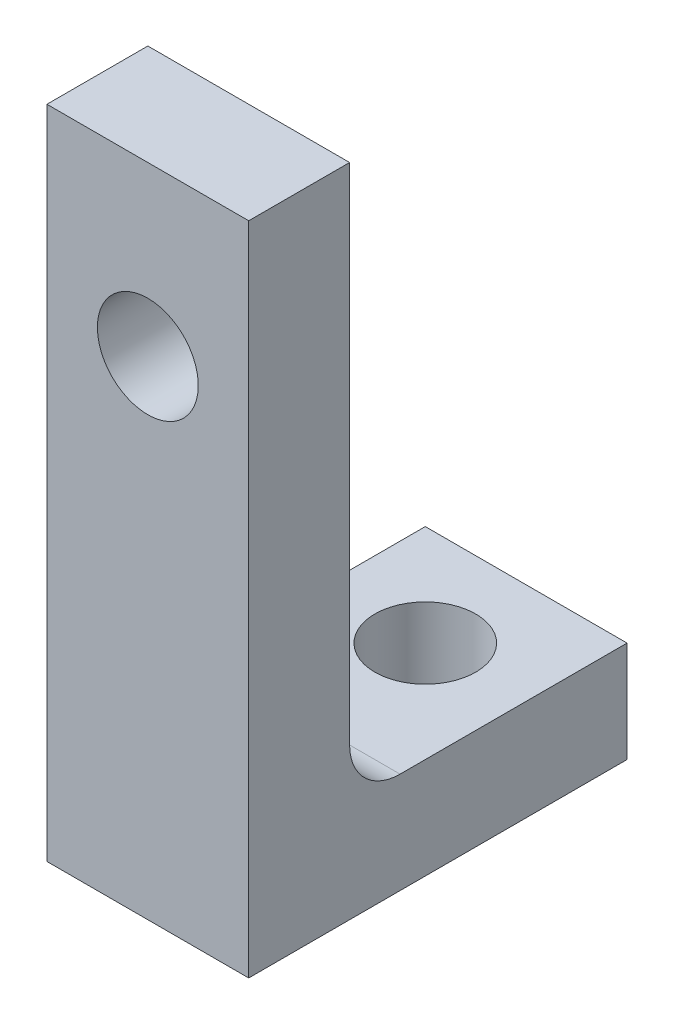
ISO-10303-21;
HEADER;
FILE_DESCRIPTION(('STEP AP214'),'2;1');
FILE_NAME('part.step','',(''),(''),'','','');
FILE_SCHEMA(('AUTOMOTIVE_DESIGN { 1 0 10303 214 1 1 1 1 }'));
ENDSEC;
DATA;
#1=APPLICATION_CONTEXT('core data for automotive mechanical design processes');
#2=APPLICATION_PROTOCOL_DEFINITION('international standard','automotive_design',2000,#1);
#3=PRODUCT_CONTEXT('',#1,'mechanical');
#4=PRODUCT('Part','Part','',(#3));
#5=PRODUCT_RELATED_PRODUCT_CATEGORY('part','',(#4));
#6=PRODUCT_DEFINITION_FORMATION('','',#4);
#7=PRODUCT_DEFINITION_CONTEXT('part definition',#1,'design');
#8=PRODUCT_DEFINITION('design','',#6,#7);
#9=PRODUCT_DEFINITION_SHAPE('','',#8);
#10=(LENGTH_UNIT() NAMED_UNIT(*) SI_UNIT(.MILLI.,.METRE.));
#11=(NAMED_UNIT(*) PLANE_ANGLE_UNIT() SI_UNIT($,.RADIAN.));
#12=(NAMED_UNIT(*) SI_UNIT($,.STERADIAN.) SOLID_ANGLE_UNIT());
#13=UNCERTAINTY_MEASURE_WITH_UNIT(LENGTH_MEASURE(1.E-05),#10,'distance_accuracy_value','');
#14=(GEOMETRIC_REPRESENTATION_CONTEXT(3) GLOBAL_UNCERTAINTY_ASSIGNED_CONTEXT((#13)) GLOBAL_UNIT_ASSIGNED_CONTEXT((#10,
#11,#12)) REPRESENTATION_CONTEXT('',''));
#15=CARTESIAN_POINT('',(0.,0.,0.));
#16=DIRECTION('',(0.,0.,1.));
#17=DIRECTION('',(1.,0.,0.));
#18=AXIS2_PLACEMENT_3D('',#15,#16,#17);
#19=CARTESIAN_POINT('',(4.,0.,-5.5));
#20=DIRECTION('',(0.,-1.,0.));
#21=DIRECTION('',(0.,0.,-1.));
#22=AXIS2_PLACEMENT_3D('',#19,#20,#21);
#23=PLANE('',#22);
#24=CARTESIAN_POINT('',(2.,0.,-3.5));
#25=DIRECTION('',(0.,1.,0.));
#26=DIRECTION('',(0.,0.,1.));
#27=AXIS2_PLACEMENT_3D('',#24,#25,#26);
#28=CIRCLE('',#27,1.);
#29=CARTESIAN_POINT('',(2.,0.,-2.5));
#30=VERTEX_POINT('',#29);
#31=EDGE_CURVE('E176',#30,#30,#28,.T.);
#32=ORIENTED_EDGE('',*,*,#31,.F.);
#33=EDGE_LOOP('',(#32));
#34=FACE_BOUND('',#33,.T.);
#35=DIRECTION('',(0.,0.,1.));
#36=VECTOR('',#35,1.);
#37=CARTESIAN_POINT('',(0.,0.,-5.5));
#38=LINE('',#37,#36);
#39=CARTESIAN_POINT('',(0.,0.,-5.5));
#40=VERTEX_POINT('',#39);
#41=CARTESIAN_POINT('',(0.,0.,-1.));
#42=VERTEX_POINT('',#41);
#43=EDGE_CURVE('E132',#40,#42,#38,.T.);
#44=ORIENTED_EDGE('',*,*,#43,.T.);
#45=DIRECTION('',(-1.,0.,0.));
#46=VECTOR('',#45,1.);
#47=CARTESIAN_POINT('',(4.,0.,-1.));
#48=LINE('',#47,#46);
#49=CARTESIAN_POINT('',(4.,0.,-1.));
#50=VERTEX_POINT('',#49);
#51=EDGE_CURVE('E53',#42,#50,#48,.F.);
#52=ORIENTED_EDGE('',*,*,#51,.T.);
#53=DIRECTION('',(0.,0.,1.));
#54=VECTOR('',#53,1.);
#55=CARTESIAN_POINT('',(4.,0.,-5.5));
#56=LINE('',#55,#54);
#57=CARTESIAN_POINT('',(4.,0.,-5.5));
#58=VERTEX_POINT('',#57);
#59=EDGE_CURVE('E110',#58,#50,#56,.T.);
#60=ORIENTED_EDGE('',*,*,#59,.F.);
#61=DIRECTION('',(-1.,0.,0.));
#62=VECTOR('',#61,1.);
#63=CARTESIAN_POINT('',(4.,0.,-5.5));
#64=LINE('',#63,#62);
#65=EDGE_CURVE('E128',#58,#40,#64,.T.);
#66=ORIENTED_EDGE('',*,*,#65,.T.);
#67=EDGE_LOOP('',(#44,#52,#60,#66));
#68=FACE_BOUND('',#67,.T.);
#69=ADVANCED_FACE('F39',(#34,#68),#23,.F.);
#70=CARTESIAN_POINT('',(4.,0.,0.));
#71=DIRECTION('',(0.,0.,1.));
#72=DIRECTION('',(0.,-1.,0.));
#73=AXIS2_PLACEMENT_3D('',#70,#71,#72);
#74=PLANE('',#73);
#75=CARTESIAN_POINT('',(2.,7.67,0.));
#76=DIRECTION('',(0.,0.,-1.));
#77=DIRECTION('',(0.,1.,0.));
#78=AXIS2_PLACEMENT_3D('',#75,#76,#77);
#79=CIRCLE('',#78,1.);
#80=CARTESIAN_POINT('',(2.,8.67,0.));
#81=VERTEX_POINT('',#80);
#82=EDGE_CURVE('E168',#81,#81,#79,.T.);
#83=ORIENTED_EDGE('',*,*,#82,.F.);
#84=EDGE_LOOP('',(#83));
#85=FACE_BOUND('',#84,.T.);
#86=DIRECTION('',(0.,1.,0.));
#87=VECTOR('',#86,1.);
#88=CARTESIAN_POINT('',(4.,0.,0.));
#89=LINE('',#88,#87);
#90=CARTESIAN_POINT('',(4.,1.,0.));
#91=VERTEX_POINT('',#90);
#92=CARTESIAN_POINT('',(4.,11.,0.));
#93=VERTEX_POINT('',#92);
#94=EDGE_CURVE('E100',#91,#93,#89,.T.);
#95=ORIENTED_EDGE('',*,*,#94,.F.);
#96=DIRECTION('',(-1.,0.,0.));
#97=VECTOR('',#96,1.);
#98=CARTESIAN_POINT('',(0.,1.,0.));
#99=LINE('',#98,#97);
#100=CARTESIAN_POINT('',(0.,1.,0.));
#101=VERTEX_POINT('',#100);
#102=EDGE_CURVE('E113',#91,#101,#99,.T.);
#103=ORIENTED_EDGE('',*,*,#102,.T.);
#104=DIRECTION('',(0.,1.,0.));
#105=VECTOR('',#104,1.);
#106=CARTESIAN_POINT('',(0.,0.,0.));
#107=LINE('',#106,#105);
#108=CARTESIAN_POINT('',(0.,11.,0.));
#109=VERTEX_POINT('',#108);
#110=EDGE_CURVE('E115',#101,#109,#107,.T.);
#111=ORIENTED_EDGE('',*,*,#110,.T.);
#112=DIRECTION('',(-1.,0.,0.));
#113=VECTOR('',#112,1.);
#114=CARTESIAN_POINT('',(4.,11.,0.));
#115=LINE('',#114,#113);
#116=EDGE_CURVE('E109',#93,#109,#115,.T.);
#117=ORIENTED_EDGE('',*,*,#116,.F.);
#118=EDGE_LOOP('',(#95,#103,#111,#117));
#119=FACE_BOUND('',#118,.T.);
#120=ADVANCED_FACE('F112',(#85,#119),#74,.F.);
#121=CARTESIAN_POINT('',(4.,11.,0.));
#122=DIRECTION('',(0.,-1.,0.));
#123=DIRECTION('',(0.,0.,-1.));
#124=AXIS2_PLACEMENT_3D('',#121,#122,#123);
#125=PLANE('',#124);
#126=DIRECTION('',(0.,0.,1.));
#127=VECTOR('',#126,1.);
#128=CARTESIAN_POINT('',(0.,11.,0.));
#129=LINE('',#128,#127);
#130=CARTESIAN_POINT('',(0.,11.,2.));
#131=VERTEX_POINT('',#130);
#132=EDGE_CURVE('E133',#109,#131,#129,.T.);
#133=ORIENTED_EDGE('',*,*,#132,.T.);
#134=DIRECTION('',(-1.,0.,0.));
#135=VECTOR('',#134,1.);
#136=CARTESIAN_POINT('',(4.,11.,2.));
#137=LINE('',#136,#135);
#138=CARTESIAN_POINT('',(4.,11.,2.));
#139=VERTEX_POINT('',#138);
#140=EDGE_CURVE('E117',#139,#131,#137,.T.);
#141=ORIENTED_EDGE('',*,*,#140,.F.);
#142=DIRECTION('',(0.,0.,1.));
#143=VECTOR('',#142,1.);
#144=CARTESIAN_POINT('',(4.,11.,0.));
#145=LINE('',#144,#143);
#146=EDGE_CURVE('E101',#93,#139,#145,.T.);
#147=ORIENTED_EDGE('',*,*,#146,.F.);
#148=ORIENTED_EDGE('',*,*,#116,.T.);
#149=EDGE_LOOP('',(#133,#141,#147,#148));
#150=FACE_BOUND('',#149,.T.);
#151=ADVANCED_FACE('F119',(#150),#125,.F.);
#152=CARTESIAN_POINT('',(4.,11.,2.));
#153=DIRECTION('',(0.,0.,-1.));
#154=DIRECTION('',(0.,1.,0.));
#155=AXIS2_PLACEMENT_3D('',#152,#153,#154);
#156=PLANE('',#155);
#157=CARTESIAN_POINT('',(2.,7.67,2.));
#158=DIRECTION('',(0.,0.,-1.));
#159=DIRECTION('',(0.,1.,0.));
#160=AXIS2_PLACEMENT_3D('',#157,#158,#159);
#161=CIRCLE('',#160,1.);
#162=CARTESIAN_POINT('',(2.,8.67,2.));
#163=VERTEX_POINT('',#162);
#164=EDGE_CURVE('E134',#163,#163,#161,.T.);
#165=ORIENTED_EDGE('',*,*,#164,.T.);
#166=EDGE_LOOP('',(#165));
#167=FACE_BOUND('',#166,.T.);
#168=DIRECTION('',(0.,-1.,0.));
#169=VECTOR('',#168,1.);
#170=CARTESIAN_POINT('',(0.,11.,2.));
#171=LINE('',#170,#169);
#172=CARTESIAN_POINT('',(0.,-2.,2.));
#173=VERTEX_POINT('',#172);
#174=EDGE_CURVE('E137',#131,#173,#171,.T.);
#175=ORIENTED_EDGE('',*,*,#174,.T.);
#176=DIRECTION('',(-1.,0.,0.));
#177=VECTOR('',#176,1.);
#178=CARTESIAN_POINT('',(4.,-2.,2.));
#179=LINE('',#178,#177);
#180=CARTESIAN_POINT('',(4.,-2.,2.));
#181=VERTEX_POINT('',#180);
#182=EDGE_CURVE('E146',#181,#173,#179,.T.);
#183=ORIENTED_EDGE('',*,*,#182,.F.);
#184=DIRECTION('',(0.,-1.,0.));
#185=VECTOR('',#184,1.);
#186=CARTESIAN_POINT('',(4.,11.,2.));
#187=LINE('',#186,#185);
#188=EDGE_CURVE('E121',#139,#181,#187,.T.);
#189=ORIENTED_EDGE('',*,*,#188,.F.);
#190=ORIENTED_EDGE('',*,*,#140,.T.);
#191=EDGE_LOOP('',(#175,#183,#189,#190));
#192=FACE_BOUND('',#191,.T.);
#193=ADVANCED_FACE('F158',(#167,#192),#156,.F.);
#194=CARTESIAN_POINT('',(4.,-2.,2.));
#195=DIRECTION('',(0.,1.,0.));
#196=DIRECTION('',(0.,0.,1.));
#197=AXIS2_PLACEMENT_3D('',#194,#195,#196);
#198=PLANE('',#197);
#199=CARTESIAN_POINT('',(2.,-2.,-3.5));
#200=DIRECTION('',(0.,1.,0.));
#201=DIRECTION('',(0.,0.,1.));
#202=AXIS2_PLACEMENT_3D('',#199,#200,#201);
#203=CIRCLE('',#202,1.);
#204=CARTESIAN_POINT('',(2.,-2.,-2.5));
#205=VERTEX_POINT('',#204);
#206=EDGE_CURVE('E174',#205,#205,#203,.T.);
#207=ORIENTED_EDGE('',*,*,#206,.T.);
#208=EDGE_LOOP('',(#207));
#209=FACE_BOUND('',#208,.T.);
#210=DIRECTION('',(0.,0.,-1.));
#211=VECTOR('',#210,1.);
#212=CARTESIAN_POINT('',(0.,-2.,2.));
#213=LINE('',#212,#211);
#214=CARTESIAN_POINT('',(0.,-2.,-5.5));
#215=VERTEX_POINT('',#214);
#216=EDGE_CURVE('E138',#173,#215,#213,.T.);
#217=ORIENTED_EDGE('',*,*,#216,.T.);
#218=DIRECTION('',(-1.,0.,0.));
#219=VECTOR('',#218,1.);
#220=CARTESIAN_POINT('',(4.,-2.,-5.5));
#221=LINE('',#220,#219);
#222=CARTESIAN_POINT('',(4.,-2.,-5.5));
#223=VERTEX_POINT('',#222);
#224=EDGE_CURVE('E144',#223,#215,#221,.T.);
#225=ORIENTED_EDGE('',*,*,#224,.F.);
#226=DIRECTION('',(0.,0.,-1.));
#227=VECTOR('',#226,1.);
#228=CARTESIAN_POINT('',(4.,-2.,2.));
#229=LINE('',#228,#227);
#230=EDGE_CURVE('E124',#181,#223,#229,.T.);
#231=ORIENTED_EDGE('',*,*,#230,.F.);
#232=ORIENTED_EDGE('',*,*,#182,.T.);
#233=EDGE_LOOP('',(#217,#225,#231,#232));
#234=FACE_BOUND('',#233,.T.);
#235=ADVANCED_FACE('F164',(#209,#234),#198,.F.);
#236=CARTESIAN_POINT('',(4.,-2.,-5.5));
#237=DIRECTION('',(0.,0.,1.));
#238=DIRECTION('',(1.,0.,0.));
#239=AXIS2_PLACEMENT_3D('',#236,#237,#238);
#240=PLANE('',#239);
#241=DIRECTION('',(0.,1.,0.));
#242=VECTOR('',#241,1.);
#243=CARTESIAN_POINT('',(0.,-2.,-5.5));
#244=LINE('',#243,#242);
#245=EDGE_CURVE('E143',#215,#40,#244,.T.);
#246=ORIENTED_EDGE('',*,*,#245,.T.);
#247=ORIENTED_EDGE('',*,*,#65,.F.);
#248=DIRECTION('',(0.,1.,0.));
#249=VECTOR('',#248,1.);
#250=CARTESIAN_POINT('',(4.,-2.,-5.5));
#251=LINE('',#250,#249);
#252=EDGE_CURVE('E126',#223,#58,#251,.T.);
#253=ORIENTED_EDGE('',*,*,#252,.F.);
#254=ORIENTED_EDGE('',*,*,#224,.T.);
#255=EDGE_LOOP('',(#246,#247,#253,#254));
#256=FACE_BOUND('',#255,.T.);
#257=ADVANCED_FACE('F169',(#256),#240,.F.);
#258=CARTESIAN_POINT('',(4.,0.,0.));
#259=DIRECTION('',(-1.,0.,0.));
#260=DIRECTION('',(0.,0.,1.));
#261=AXIS2_PLACEMENT_3D('',#258,#259,#260);
#262=PLANE('',#261);
#263=ORIENTED_EDGE('',*,*,#59,.T.);
#264=CARTESIAN_POINT('',(4.,1.,-1.));
#265=DIRECTION('',(-1.,0.,0.));
#266=DIRECTION('',(0.,0.,1.));
#267=AXIS2_PLACEMENT_3D('',#264,#265,#266);
#268=CIRCLE('',#267,1.);
#269=EDGE_CURVE('E11',#50,#91,#268,.T.);
#270=ORIENTED_EDGE('',*,*,#269,.T.);
#271=ORIENTED_EDGE('',*,*,#94,.T.);
#272=ORIENTED_EDGE('',*,*,#146,.T.);
#273=ORIENTED_EDGE('',*,*,#188,.T.);
#274=ORIENTED_EDGE('',*,*,#230,.T.);
#275=ORIENTED_EDGE('',*,*,#252,.T.);
#276=EDGE_LOOP('',(#263,#270,#271,#272,#273,#274,#275));
#277=FACE_BOUND('',#276,.T.);
#278=ADVANCED_FACE('F97',(#277),#262,.F.);
#279=CARTESIAN_POINT('',(0.,0.,0.));
#280=DIRECTION('',(-1.,0.,0.));
#281=DIRECTION('',(0.,0.,1.));
#282=AXIS2_PLACEMENT_3D('',#279,#280,#281);
#283=PLANE('',#282);
#284=ORIENTED_EDGE('',*,*,#43,.F.);
#285=ORIENTED_EDGE('',*,*,#245,.F.);
#286=ORIENTED_EDGE('',*,*,#216,.F.);
#287=ORIENTED_EDGE('',*,*,#174,.F.);
#288=ORIENTED_EDGE('',*,*,#132,.F.);
#289=ORIENTED_EDGE('',*,*,#110,.F.);
#290=CARTESIAN_POINT('',(0.,1.,-1.));
#291=DIRECTION('',(-1.,0.,0.));
#292=DIRECTION('',(0.,0.,1.));
#293=AXIS2_PLACEMENT_3D('',#290,#291,#292);
#294=CIRCLE('',#293,1.);
#295=EDGE_CURVE('E50',#101,#42,#294,.F.);
#296=ORIENTED_EDGE('',*,*,#295,.T.);
#297=EDGE_LOOP('',(#284,#285,#286,#287,#288,#289,#296));
#298=FACE_BOUND('',#297,.T.);
#299=ADVANCED_FACE('F152',(#298),#283,.T.);
#300=CARTESIAN_POINT('',(2.,7.67,2.));
#301=DIRECTION('',(0.,0.,-1.));
#302=DIRECTION('',(0.,1.,0.));
#303=AXIS2_PLACEMENT_3D('',#300,#301,#302);
#304=CYLINDRICAL_SURFACE('',#303,1.);
#305=ORIENTED_EDGE('',*,*,#164,.F.);
#306=EDGE_LOOP('',(#305));
#307=FACE_BOUND('',#306,.T.);
#308=ORIENTED_EDGE('',*,*,#82,.T.);
#309=EDGE_LOOP('',(#308));
#310=FACE_BOUND('',#309,.T.);
#311=ADVANCED_FACE('F187',(#307,#310),#304,.F.);
#312=CARTESIAN_POINT('',(2.,-2.,-3.5));
#313=DIRECTION('',(0.,1.,0.));
#314=DIRECTION('',(0.,0.,1.));
#315=AXIS2_PLACEMENT_3D('',#312,#313,#314);
#316=CYLINDRICAL_SURFACE('',#315,1.);
#317=ORIENTED_EDGE('',*,*,#206,.F.);
#318=EDGE_LOOP('',(#317));
#319=FACE_BOUND('',#318,.T.);
#320=ORIENTED_EDGE('',*,*,#31,.T.);
#321=EDGE_LOOP('',(#320));
#322=FACE_BOUND('',#321,.T.);
#323=ADVANCED_FACE('F181',(#319,#322),#316,.F.);
#324=CARTESIAN_POINT('',(4.,1.,-1.));
#325=DIRECTION('',(1.,0.,0.));
#326=DIRECTION('',(0.,0.,-1.));
#327=AXIS2_PLACEMENT_3D('',#324,#325,#326);
#328=CYLINDRICAL_SURFACE('',#327,1.);
#329=ORIENTED_EDGE('',*,*,#269,.F.);
#330=ORIENTED_EDGE('',*,*,#51,.F.);
#331=ORIENTED_EDGE('',*,*,#295,.F.);
#332=ORIENTED_EDGE('',*,*,#102,.F.);
#333=EDGE_LOOP('',(#329,#330,#331,#332));
#334=FACE_BOUND('',#333,.T.);
#335=ADVANCED_FACE('F41',(#334),#328,.F.);
#336=CLOSED_SHELL('',(#69,#120,#151,#193,#235,#257,#278,#299,#311,#323,#335));
#337=MANIFOLD_SOLID_BREP('B2',#336);
#338=ADVANCED_BREP_SHAPE_REPRESENTATION('',(#18,#337),#14);
#339=SHAPE_DEFINITION_REPRESENTATION(#9,#338);
ENDSEC;
END-ISO-10303-21;
